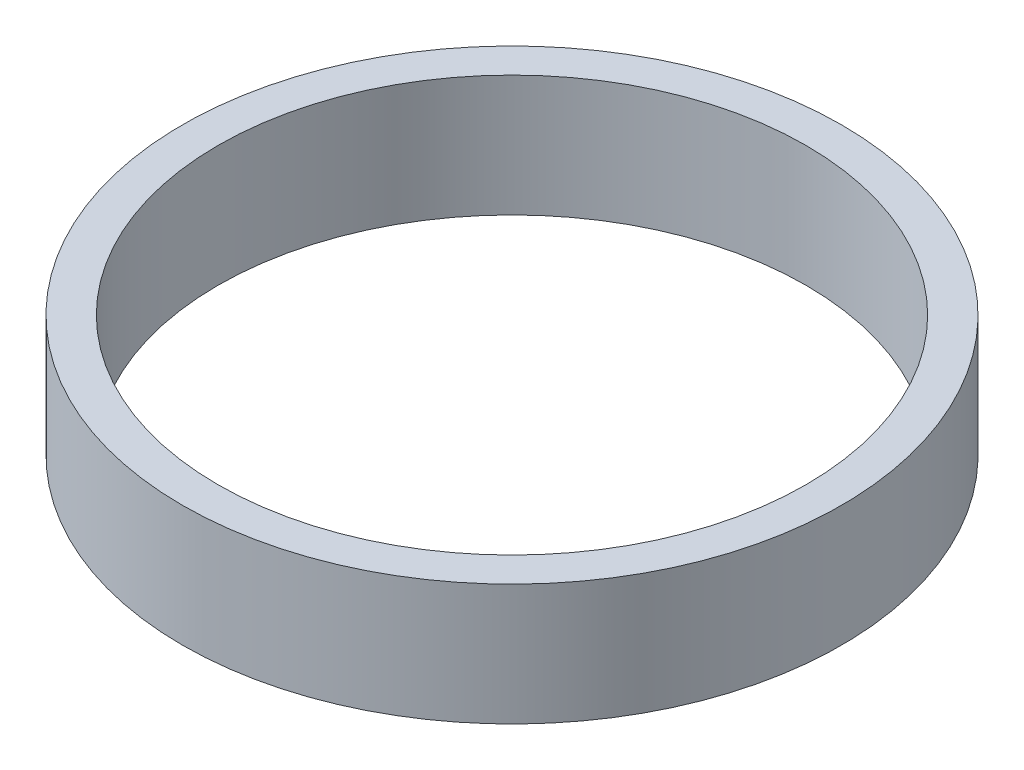
ISO-10303-21;
HEADER;
FILE_DESCRIPTION(('STEP AP214'),'2;1');
FILE_NAME('part.step','',(''),(''),'','','');
FILE_SCHEMA(('AUTOMOTIVE_DESIGN { 1 0 10303 214 1 1 1 1 }'));
ENDSEC;
DATA;
#1=APPLICATION_CONTEXT('core data for automotive mechanical design processes');
#2=APPLICATION_PROTOCOL_DEFINITION('international standard','automotive_design',2000,#1);
#3=PRODUCT_CONTEXT('',#1,'mechanical');
#4=PRODUCT('Part','Part','',(#3));
#5=PRODUCT_RELATED_PRODUCT_CATEGORY('part','',(#4));
#6=PRODUCT_DEFINITION_FORMATION('','',#4);
#7=PRODUCT_DEFINITION_CONTEXT('part definition',#1,'design');
#8=PRODUCT_DEFINITION('design','',#6,#7);
#9=PRODUCT_DEFINITION_SHAPE('','',#8);
#10=(LENGTH_UNIT() NAMED_UNIT(*) SI_UNIT(.MILLI.,.METRE.));
#11=(NAMED_UNIT(*) PLANE_ANGLE_UNIT() SI_UNIT($,.RADIAN.));
#12=(NAMED_UNIT(*) SI_UNIT($,.STERADIAN.) SOLID_ANGLE_UNIT());
#13=UNCERTAINTY_MEASURE_WITH_UNIT(LENGTH_MEASURE(1.E-05),#10,'distance_accuracy_value','');
#14=(GEOMETRIC_REPRESENTATION_CONTEXT(3) GLOBAL_UNCERTAINTY_ASSIGNED_CONTEXT((#13)) GLOBAL_UNIT_ASSIGNED_CONTEXT((#10,
#11,#12)) REPRESENTATION_CONTEXT('',''));
#15=CARTESIAN_POINT('',(0.,0.,0.));
#16=DIRECTION('',(0.,0.,1.));
#17=DIRECTION('',(1.,0.,0.));
#18=AXIS2_PLACEMENT_3D('',#15,#16,#17);
#19=CARTESIAN_POINT('',(0.,1.7,0.));
#20=DIRECTION('',(0.,1.,0.));
#21=DIRECTION('',(0.,0.,1.));
#22=AXIS2_PLACEMENT_3D('',#19,#20,#21);
#23=PLANE('',#22);
#24=CARTESIAN_POINT('',(0.,1.7,0.));
#25=DIRECTION('',(0.,1.,0.));
#26=DIRECTION('',(0.,0.,1.));
#27=AXIS2_PLACEMENT_3D('',#24,#25,#26);
#28=CIRCLE('',#27,4.625);
#29=CARTESIAN_POINT('',(0.,1.7,4.625));
#30=VERTEX_POINT('',#29);
#31=EDGE_CURVE('E10',#30,#30,#28,.T.);
#32=ORIENTED_EDGE('',*,*,#31,.T.);
#33=EDGE_LOOP('',(#32));
#34=FACE_BOUND('',#33,.T.);
#35=CARTESIAN_POINT('',(0.,1.7,0.));
#36=DIRECTION('',(0.,1.,0.));
#37=DIRECTION('',(0.,0.,1.));
#38=AXIS2_PLACEMENT_3D('',#35,#36,#37);
#39=CIRCLE('',#38,4.125);
#40=CARTESIAN_POINT('',(0.,1.7,4.125));
#41=VERTEX_POINT('',#40);
#42=EDGE_CURVE('E50',#41,#41,#39,.T.);
#43=ORIENTED_EDGE('',*,*,#42,.F.);
#44=EDGE_LOOP('',(#43));
#45=FACE_BOUND('',#44,.T.);
#46=ADVANCED_FACE('F39',(#34,#45),#23,.T.);
#47=CARTESIAN_POINT('',(0.,0.,0.));
#48=DIRECTION('',(0.,1.,0.));
#49=DIRECTION('',(0.,0.,1.));
#50=AXIS2_PLACEMENT_3D('',#47,#48,#49);
#51=PLANE('',#50);
#52=CARTESIAN_POINT('',(0.,0.,0.));
#53=DIRECTION('',(0.,1.,0.));
#54=DIRECTION('',(0.,0.,1.));
#55=AXIS2_PLACEMENT_3D('',#52,#53,#54);
#56=CIRCLE('',#55,4.625);
#57=CARTESIAN_POINT('',(0.,0.,4.625));
#58=VERTEX_POINT('',#57);
#59=EDGE_CURVE('E43',#58,#58,#56,.T.);
#60=ORIENTED_EDGE('',*,*,#59,.F.);
#61=EDGE_LOOP('',(#60));
#62=FACE_BOUND('',#61,.T.);
#63=CARTESIAN_POINT('',(0.,0.,0.));
#64=DIRECTION('',(0.,1.,0.));
#65=DIRECTION('',(0.,0.,1.));
#66=AXIS2_PLACEMENT_3D('',#63,#64,#65);
#67=CIRCLE('',#66,4.125);
#68=CARTESIAN_POINT('',(0.,0.,4.125));
#69=VERTEX_POINT('',#68);
#70=EDGE_CURVE('E52',#69,#69,#67,.T.);
#71=ORIENTED_EDGE('',*,*,#70,.T.);
#72=EDGE_LOOP('',(#71));
#73=FACE_BOUND('',#72,.T.);
#74=ADVANCED_FACE('F62',(#62,#73),#51,.F.);
#75=CARTESIAN_POINT('',(0.,1.7,0.));
#76=DIRECTION('',(0.,-1.,0.));
#77=DIRECTION('',(0.,0.,-1.));
#78=AXIS2_PLACEMENT_3D('',#75,#76,#77);
#79=CYLINDRICAL_SURFACE('',#78,4.625);
#80=ORIENTED_EDGE('',*,*,#31,.F.);
#81=EDGE_LOOP('',(#80));
#82=FACE_BOUND('',#81,.T.);
#83=ORIENTED_EDGE('',*,*,#59,.T.);
#84=EDGE_LOOP('',(#83));
#85=FACE_BOUND('',#84,.T.);
#86=ADVANCED_FACE('F41',(#82,#85),#79,.T.);
#87=CARTESIAN_POINT('',(0.,1.7,0.));
#88=DIRECTION('',(0.,-1.,0.));
#89=DIRECTION('',(0.,0.,-1.));
#90=AXIS2_PLACEMENT_3D('',#87,#88,#89);
#91=CYLINDRICAL_SURFACE('',#90,4.125);
#92=ORIENTED_EDGE('',*,*,#42,.T.);
#93=EDGE_LOOP('',(#92));
#94=FACE_BOUND('',#93,.T.);
#95=ORIENTED_EDGE('',*,*,#70,.F.);
#96=EDGE_LOOP('',(#95));
#97=FACE_BOUND('',#96,.T.);
#98=ADVANCED_FACE('F58',(#94,#97),#91,.F.);
#99=CLOSED_SHELL('',(#46,#74,#86,#98));
#100=MANIFOLD_SOLID_BREP('B2',#99);
#101=ADVANCED_BREP_SHAPE_REPRESENTATION('',(#18,#100),#14);
#102=SHAPE_DEFINITION_REPRESENTATION(#9,#101);
ENDSEC;
END-ISO-10303-21;
